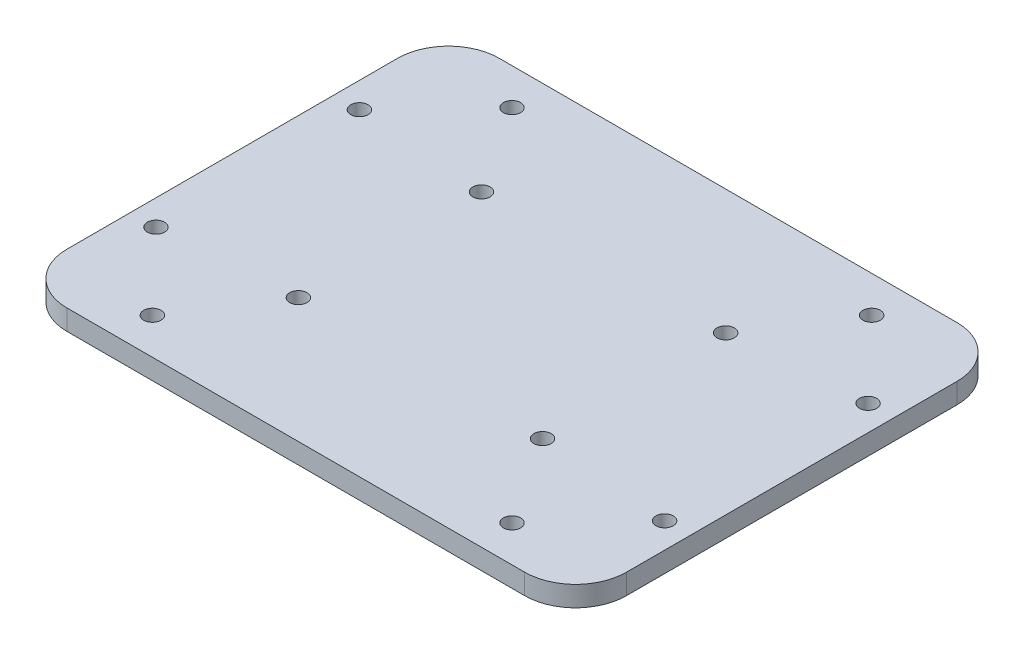
ISO-10303-21;
HEADER;
FILE_DESCRIPTION(('STEP AP214'),'2;1');
FILE_NAME('part.step','',(''),(''),'','','');
FILE_SCHEMA(('AUTOMOTIVE_DESIGN { 1 0 10303 214 1 1 1 1 }'));
ENDSEC;
DATA;
#1=APPLICATION_CONTEXT('core data for automotive mechanical design processes');
#2=APPLICATION_PROTOCOL_DEFINITION('international standard','automotive_design',2000,#1);
#3=PRODUCT_CONTEXT('',#1,'mechanical');
#4=PRODUCT('Part','Part','',(#3));
#5=PRODUCT_RELATED_PRODUCT_CATEGORY('part','',(#4));
#6=PRODUCT_DEFINITION_FORMATION('','',#4);
#7=PRODUCT_DEFINITION_CONTEXT('part definition',#1,'design');
#8=PRODUCT_DEFINITION('design','',#6,#7);
#9=PRODUCT_DEFINITION_SHAPE('','',#8);
#10=(LENGTH_UNIT() NAMED_UNIT(*) SI_UNIT(.MILLI.,.METRE.));
#11=(NAMED_UNIT(*) PLANE_ANGLE_UNIT() SI_UNIT($,.RADIAN.));
#12=(NAMED_UNIT(*) SI_UNIT($,.STERADIAN.) SOLID_ANGLE_UNIT());
#13=UNCERTAINTY_MEASURE_WITH_UNIT(LENGTH_MEASURE(1.E-05),#10,'distance_accuracy_value','');
#14=(GEOMETRIC_REPRESENTATION_CONTEXT(3) GLOBAL_UNCERTAINTY_ASSIGNED_CONTEXT((#13)) GLOBAL_UNIT_ASSIGNED_CONTEXT((#10,
#11,#12)) REPRESENTATION_CONTEXT('',''));
#15=CARTESIAN_POINT('',(0.,0.,0.));
#16=DIRECTION('',(0.,0.,1.));
#17=DIRECTION('',(1.,0.,0.));
#18=AXIS2_PLACEMENT_3D('',#15,#16,#17);
#19=CARTESIAN_POINT('',(0.,4.,0.));
#20=DIRECTION('',(0.,1.,0.));
#21=DIRECTION('',(0.,0.,1.));
#22=AXIS2_PLACEMENT_3D('',#19,#20,#21);
#23=PLANE('',#22);
#24=CARTESIAN_POINT('',(50.,4.,20.));
#25=DIRECTION('',(0.,1.,0.));
#26=DIRECTION('',(0.,0.,1.));
#27=AXIS2_PLACEMENT_3D('',#24,#25,#26);
#28=CIRCLE('',#27,1.7);
#29=CARTESIAN_POINT('',(50.,4.,21.7));
#30=VERTEX_POINT('',#29);
#31=EDGE_CURVE('E250',#30,#30,#28,.T.);
#32=ORIENTED_EDGE('',*,*,#31,.F.);
#33=EDGE_LOOP('',(#32));
#34=FACE_BOUND('',#33,.T.);
#35=CARTESIAN_POINT('',(-50.,4.,-20.));
#36=DIRECTION('',(0.,1.,0.));
#37=DIRECTION('',(0.,0.,1.));
#38=AXIS2_PLACEMENT_3D('',#35,#36,#37);
#39=CIRCLE('',#38,1.7);
#40=CARTESIAN_POINT('',(-50.,4.,-18.3));
#41=VERTEX_POINT('',#40);
#42=EDGE_CURVE('E247',#41,#41,#39,.T.);
#43=ORIENTED_EDGE('',*,*,#42,.F.);
#44=EDGE_LOOP('',(#43));
#45=FACE_BOUND('',#44,.T.);
#46=CARTESIAN_POINT('',(-50.,4.,20.));
#47=DIRECTION('',(0.,1.,0.));
#48=DIRECTION('',(0.,0.,1.));
#49=AXIS2_PLACEMENT_3D('',#46,#47,#48);
#50=CIRCLE('',#49,1.7);
#51=CARTESIAN_POINT('',(-50.,4.,21.7));
#52=VERTEX_POINT('',#51);
#53=EDGE_CURVE('E252',#52,#52,#50,.T.);
#54=ORIENTED_EDGE('',*,*,#53,.F.);
#55=EDGE_LOOP('',(#54));
#56=FACE_BOUND('',#55,.T.);
#57=CARTESIAN_POINT('',(50.,4.,-20.));
#58=DIRECTION('',(0.,1.,0.));
#59=DIRECTION('',(0.,0.,1.));
#60=AXIS2_PLACEMENT_3D('',#57,#58,#59);
#61=CIRCLE('',#60,1.7);
#62=CARTESIAN_POINT('',(50.,4.,-18.3));
#63=VERTEX_POINT('',#62);
#64=EDGE_CURVE('E152',#63,#63,#61,.T.);
#65=ORIENTED_EDGE('',*,*,#64,.F.);
#66=EDGE_LOOP('',(#65));
#67=FACE_BOUND('',#66,.T.);
#68=CARTESIAN_POINT('',(35.355,4.,35.355));
#69=DIRECTION('',(0.,1.,0.));
#70=DIRECTION('',(0.,0.,1.));
#71=AXIS2_PLACEMENT_3D('',#68,#69,#70);
#72=CIRCLE('',#71,1.7);
#73=CARTESIAN_POINT('',(35.355,4.,37.055));
#74=VERTEX_POINT('',#73);
#75=EDGE_CURVE('E235',#74,#74,#72,.T.);
#76=ORIENTED_EDGE('',*,*,#75,.F.);
#77=EDGE_LOOP('',(#76));
#78=FACE_BOUND('',#77,.T.);
#79=CARTESIAN_POINT('',(-35.355,4.,-35.355));
#80=DIRECTION('',(0.,1.,0.));
#81=DIRECTION('',(0.,0.,1.));
#82=AXIS2_PLACEMENT_3D('',#79,#80,#81);
#83=CIRCLE('',#82,1.7);
#84=CARTESIAN_POINT('',(-35.355,4.,-33.655));
#85=VERTEX_POINT('',#84);
#86=EDGE_CURVE('E217',#85,#85,#83,.T.);
#87=ORIENTED_EDGE('',*,*,#86,.F.);
#88=EDGE_LOOP('',(#87));
#89=FACE_BOUND('',#88,.T.);
#90=CARTESIAN_POINT('',(-24.,4.,18.));
#91=DIRECTION('',(0.,1.,0.));
#92=DIRECTION('',(0.,0.,1.));
#93=AXIS2_PLACEMENT_3D('',#90,#91,#92);
#94=CIRCLE('',#93,1.7);
#95=CARTESIAN_POINT('',(-24.,4.,19.7));
#96=VERTEX_POINT('',#95);
#97=EDGE_CURVE('E206',#96,#96,#94,.T.);
#98=ORIENTED_EDGE('',*,*,#97,.F.);
#99=EDGE_LOOP('',(#98));
#100=FACE_BOUND('',#99,.T.);
#101=CARTESIAN_POINT('',(24.,4.,-18.));
#102=DIRECTION('',(0.,1.,0.));
#103=DIRECTION('',(0.,0.,1.));
#104=AXIS2_PLACEMENT_3D('',#101,#102,#103);
#105=CIRCLE('',#104,1.7);
#106=CARTESIAN_POINT('',(24.,4.,-16.3));
#107=VERTEX_POINT('',#106);
#108=EDGE_CURVE('E137',#107,#107,#105,.T.);
#109=ORIENTED_EDGE('',*,*,#108,.F.);
#110=EDGE_LOOP('',(#109));
#111=FACE_BOUND('',#110,.T.);
#112=DIRECTION('',(1.,0.,0.));
#113=VECTOR('',#112,1.);
#114=CARTESIAN_POINT('',(-55.,4.,42.5));
#115=LINE('',#114,#113);
#116=CARTESIAN_POINT('',(-45.,4.,42.5));
#117=VERTEX_POINT('',#116);
#118=CARTESIAN_POINT('',(45.,4.,42.5));
#119=VERTEX_POINT('',#118);
#120=EDGE_CURVE('E143',#117,#119,#115,.T.);
#121=ORIENTED_EDGE('',*,*,#120,.T.);
#122=CARTESIAN_POINT('',(45.,4.,32.5));
#123=DIRECTION('',(0.,1.,0.));
#124=DIRECTION('',(0.,0.,1.));
#125=AXIS2_PLACEMENT_3D('',#122,#123,#124);
#126=CIRCLE('',#125,10.);
#127=CARTESIAN_POINT('',(55.,4.,32.5));
#128=VERTEX_POINT('',#127);
#129=EDGE_CURVE('E180',#119,#128,#126,.T.);
#130=ORIENTED_EDGE('',*,*,#129,.T.);
#131=DIRECTION('',(0.,0.,-1.));
#132=VECTOR('',#131,1.);
#133=CARTESIAN_POINT('',(55.,4.,-42.5));
#134=LINE('',#133,#132);
#135=CARTESIAN_POINT('',(55.,4.,-32.5));
#136=VERTEX_POINT('',#135);
#137=EDGE_CURVE('E130',#128,#136,#134,.T.);
#138=ORIENTED_EDGE('',*,*,#137,.T.);
#139=CARTESIAN_POINT('',(45.,4.,-32.5));
#140=DIRECTION('',(0.,1.,0.));
#141=DIRECTION('',(0.,0.,1.));
#142=AXIS2_PLACEMENT_3D('',#139,#140,#141);
#143=CIRCLE('',#142,10.);
#144=CARTESIAN_POINT('',(45.,4.,-42.5));
#145=VERTEX_POINT('',#144);
#146=EDGE_CURVE('E172',#136,#145,#143,.T.);
#147=ORIENTED_EDGE('',*,*,#146,.T.);
#148=DIRECTION('',(-1.,0.,0.));
#149=VECTOR('',#148,1.);
#150=CARTESIAN_POINT('',(-55.,4.,-42.5));
#151=LINE('',#150,#149);
#152=CARTESIAN_POINT('',(-45.,4.,-42.5));
#153=VERTEX_POINT('',#152);
#154=EDGE_CURVE('E189',#145,#153,#151,.T.);
#155=ORIENTED_EDGE('',*,*,#154,.T.);
#156=CARTESIAN_POINT('',(-45.,4.,-32.5));
#157=DIRECTION('',(0.,1.,0.));
#158=DIRECTION('',(0.,0.,1.));
#159=AXIS2_PLACEMENT_3D('',#156,#157,#158);
#160=CIRCLE('',#159,10.);
#161=CARTESIAN_POINT('',(-55.,4.,-32.5));
#162=VERTEX_POINT('',#161);
#163=EDGE_CURVE('E64',#153,#162,#160,.T.);
#164=ORIENTED_EDGE('',*,*,#163,.T.);
#165=DIRECTION('',(0.,0.,1.));
#166=VECTOR('',#165,1.);
#167=CARTESIAN_POINT('',(-55.,4.,-42.5));
#168=LINE('',#167,#166);
#169=CARTESIAN_POINT('',(-55.,4.,32.5));
#170=VERTEX_POINT('',#169);
#171=EDGE_CURVE('E199',#162,#170,#168,.T.);
#172=ORIENTED_EDGE('',*,*,#171,.T.);
#173=CARTESIAN_POINT('',(-45.,4.,32.5));
#174=DIRECTION('',(0.,1.,0.));
#175=DIRECTION('',(0.,0.,1.));
#176=AXIS2_PLACEMENT_3D('',#173,#174,#175);
#177=CIRCLE('',#176,10.);
#178=EDGE_CURVE('E175',#170,#117,#177,.T.);
#179=ORIENTED_EDGE('',*,*,#178,.T.);
#180=EDGE_LOOP('',(#121,#130,#138,#147,#155,#164,#172,#179));
#181=FACE_BOUND('',#180,.T.);
#182=CARTESIAN_POINT('',(-24.,4.,-18.));
#183=DIRECTION('',(0.,1.,0.));
#184=DIRECTION('',(0.,0.,1.));
#185=AXIS2_PLACEMENT_3D('',#182,#183,#184);
#186=CIRCLE('',#185,1.7);
#187=CARTESIAN_POINT('',(-24.,4.,-16.3));
#188=VERTEX_POINT('',#187);
#189=EDGE_CURVE('E204',#188,#188,#186,.T.);
#190=ORIENTED_EDGE('',*,*,#189,.F.);
#191=EDGE_LOOP('',(#190));
#192=FACE_BOUND('',#191,.T.);
#193=CARTESIAN_POINT('',(24.,4.,18.));
#194=DIRECTION('',(0.,1.,0.));
#195=DIRECTION('',(0.,0.,1.));
#196=AXIS2_PLACEMENT_3D('',#193,#194,#195);
#197=CIRCLE('',#196,1.7);
#198=CARTESIAN_POINT('',(24.,4.,19.7));
#199=VERTEX_POINT('',#198);
#200=EDGE_CURVE('E211',#199,#199,#197,.T.);
#201=ORIENTED_EDGE('',*,*,#200,.F.);
#202=EDGE_LOOP('',(#201));
#203=FACE_BOUND('',#202,.T.);
#204=CARTESIAN_POINT('',(35.355,4.,-35.355));
#205=DIRECTION('',(0.,1.,0.));
#206=DIRECTION('',(0.,0.,1.));
#207=AXIS2_PLACEMENT_3D('',#204,#205,#206);
#208=CIRCLE('',#207,1.7);
#209=CARTESIAN_POINT('',(35.355,4.,-33.655));
#210=VERTEX_POINT('',#209);
#211=EDGE_CURVE('E228',#210,#210,#208,.T.);
#212=ORIENTED_EDGE('',*,*,#211,.F.);
#213=EDGE_LOOP('',(#212));
#214=FACE_BOUND('',#213,.T.);
#215=CARTESIAN_POINT('',(-35.355,4.,35.355));
#216=DIRECTION('',(0.,1.,0.));
#217=DIRECTION('',(0.,0.,1.));
#218=AXIS2_PLACEMENT_3D('',#215,#216,#217);
#219=CIRCLE('',#218,1.7);
#220=CARTESIAN_POINT('',(-35.355,4.,37.055));
#221=VERTEX_POINT('',#220);
#222=EDGE_CURVE('E238',#221,#221,#219,.T.);
#223=ORIENTED_EDGE('',*,*,#222,.F.);
#224=EDGE_LOOP('',(#223));
#225=FACE_BOUND('',#224,.T.);
#226=ADVANCED_FACE('F41',(#34,#45,#56,#67,#78,#89,#100,#111,#181,#192,#203,#214,#225),#23,.T.);
#227=CARTESIAN_POINT('',(0.,0.,0.));
#228=DIRECTION('',(0.,1.,0.));
#229=DIRECTION('',(0.,0.,1.));
#230=AXIS2_PLACEMENT_3D('',#227,#228,#229);
#231=PLANE('',#230);
#232=CARTESIAN_POINT('',(50.,0.,20.));
#233=DIRECTION('',(0.,1.,0.));
#234=DIRECTION('',(0.,0.,1.));
#235=AXIS2_PLACEMENT_3D('',#232,#233,#234);
#236=CIRCLE('',#235,1.7);
#237=CARTESIAN_POINT('',(50.,0.,21.7));
#238=VERTEX_POINT('',#237);
#239=EDGE_CURVE('E163',#238,#238,#236,.T.);
#240=ORIENTED_EDGE('',*,*,#239,.T.);
#241=EDGE_LOOP('',(#240));
#242=FACE_BOUND('',#241,.T.);
#243=CARTESIAN_POINT('',(-50.,0.,-20.));
#244=DIRECTION('',(0.,1.,0.));
#245=DIRECTION('',(0.,0.,1.));
#246=AXIS2_PLACEMENT_3D('',#243,#244,#245);
#247=CIRCLE('',#246,1.7);
#248=CARTESIAN_POINT('',(-50.,0.,-18.3));
#249=VERTEX_POINT('',#248);
#250=EDGE_CURVE('E159',#249,#249,#247,.T.);
#251=ORIENTED_EDGE('',*,*,#250,.T.);
#252=EDGE_LOOP('',(#251));
#253=FACE_BOUND('',#252,.T.);
#254=CARTESIAN_POINT('',(-50.,0.,20.));
#255=DIRECTION('',(0.,1.,0.));
#256=DIRECTION('',(0.,0.,1.));
#257=AXIS2_PLACEMENT_3D('',#254,#255,#256);
#258=CIRCLE('',#257,1.7);
#259=CARTESIAN_POINT('',(-50.,0.,21.7));
#260=VERTEX_POINT('',#259);
#261=EDGE_CURVE('E153',#260,#260,#258,.T.);
#262=ORIENTED_EDGE('',*,*,#261,.T.);
#263=EDGE_LOOP('',(#262));
#264=FACE_BOUND('',#263,.T.);
#265=CARTESIAN_POINT('',(50.,0.,-20.));
#266=DIRECTION('',(0.,1.,0.));
#267=DIRECTION('',(0.,0.,1.));
#268=AXIS2_PLACEMENT_3D('',#265,#266,#267);
#269=CIRCLE('',#268,1.7);
#270=CARTESIAN_POINT('',(50.,0.,-18.3));
#271=VERTEX_POINT('',#270);
#272=EDGE_CURVE('E154',#271,#271,#269,.T.);
#273=ORIENTED_EDGE('',*,*,#272,.T.);
#274=EDGE_LOOP('',(#273));
#275=FACE_BOUND('',#274,.T.);
#276=DIRECTION('',(0.,0.,-1.));
#277=VECTOR('',#276,1.);
#278=CARTESIAN_POINT('',(55.,0.,-42.5));
#279=LINE('',#278,#277);
#280=CARTESIAN_POINT('',(55.,0.,32.5));
#281=VERTEX_POINT('',#280);
#282=CARTESIAN_POINT('',(55.,0.,-32.5));
#283=VERTEX_POINT('',#282);
#284=EDGE_CURVE('E121',#281,#283,#279,.T.);
#285=ORIENTED_EDGE('',*,*,#284,.F.);
#286=CARTESIAN_POINT('',(45.,0.,32.5));
#287=DIRECTION('',(0.,1.,0.));
#288=DIRECTION('',(0.,0.,1.));
#289=AXIS2_PLACEMENT_3D('',#286,#287,#288);
#290=CIRCLE('',#289,10.);
#291=CARTESIAN_POINT('',(45.,0.,42.5));
#292=VERTEX_POINT('',#291);
#293=EDGE_CURVE('E110',#281,#292,#290,.F.);
#294=ORIENTED_EDGE('',*,*,#293,.T.);
#295=DIRECTION('',(1.,0.,0.));
#296=VECTOR('',#295,1.);
#297=CARTESIAN_POINT('',(-55.,0.,42.5));
#298=LINE('',#297,#296);
#299=CARTESIAN_POINT('',(-45.,0.,42.5));
#300=VERTEX_POINT('',#299);
#301=EDGE_CURVE('E146',#300,#292,#298,.T.);
#302=ORIENTED_EDGE('',*,*,#301,.F.);
#303=CARTESIAN_POINT('',(-45.,0.,32.5));
#304=DIRECTION('',(0.,1.,0.));
#305=DIRECTION('',(0.,0.,1.));
#306=AXIS2_PLACEMENT_3D('',#303,#304,#305);
#307=CIRCLE('',#306,10.);
#308=CARTESIAN_POINT('',(-55.,0.,32.5));
#309=VERTEX_POINT('',#308);
#310=EDGE_CURVE('E129',#300,#309,#307,.F.);
#311=ORIENTED_EDGE('',*,*,#310,.T.);
#312=DIRECTION('',(0.,0.,1.));
#313=VECTOR('',#312,1.);
#314=CARTESIAN_POINT('',(-55.,0.,-42.5));
#315=LINE('',#314,#313);
#316=CARTESIAN_POINT('',(-55.,0.,-32.5));
#317=VERTEX_POINT('',#316);
#318=EDGE_CURVE('E136',#317,#309,#315,.T.);
#319=ORIENTED_EDGE('',*,*,#318,.F.);
#320=CARTESIAN_POINT('',(-45.,0.,-32.5));
#321=DIRECTION('',(0.,1.,0.));
#322=DIRECTION('',(0.,0.,1.));
#323=AXIS2_PLACEMENT_3D('',#320,#321,#322);
#324=CIRCLE('',#323,10.);
#325=CARTESIAN_POINT('',(-45.,0.,-42.5));
#326=VERTEX_POINT('',#325);
#327=EDGE_CURVE('E117',#317,#326,#324,.F.);
#328=ORIENTED_EDGE('',*,*,#327,.T.);
#329=DIRECTION('',(-1.,0.,0.));
#330=VECTOR('',#329,1.);
#331=CARTESIAN_POINT('',(-55.,0.,-42.5));
#332=LINE('',#331,#330);
#333=CARTESIAN_POINT('',(45.,0.,-42.5));
#334=VERTEX_POINT('',#333);
#335=EDGE_CURVE('E132',#334,#326,#332,.T.);
#336=ORIENTED_EDGE('',*,*,#335,.F.);
#337=CARTESIAN_POINT('',(45.,0.,-32.5));
#338=DIRECTION('',(0.,1.,0.));
#339=DIRECTION('',(0.,0.,1.));
#340=AXIS2_PLACEMENT_3D('',#337,#338,#339);
#341=CIRCLE('',#340,10.);
#342=EDGE_CURVE('E133',#334,#283,#341,.F.);
#343=ORIENTED_EDGE('',*,*,#342,.T.);
#344=EDGE_LOOP('',(#285,#294,#302,#311,#319,#328,#336,#343));
#345=FACE_BOUND('',#344,.T.);
#346=CARTESIAN_POINT('',(24.,0.,-18.));
#347=DIRECTION('',(0.,1.,0.));
#348=DIRECTION('',(0.,0.,1.));
#349=AXIS2_PLACEMENT_3D('',#346,#347,#348);
#350=CIRCLE('',#349,1.7);
#351=CARTESIAN_POINT('',(24.,0.,-16.3));
#352=VERTEX_POINT('',#351);
#353=EDGE_CURVE('E145',#352,#352,#350,.T.);
#354=ORIENTED_EDGE('',*,*,#353,.T.);
#355=EDGE_LOOP('',(#354));
#356=FACE_BOUND('',#355,.T.);
#357=CARTESIAN_POINT('',(-24.,0.,-18.));
#358=DIRECTION('',(0.,1.,0.));
#359=DIRECTION('',(0.,0.,1.));
#360=AXIS2_PLACEMENT_3D('',#357,#358,#359);
#361=CIRCLE('',#360,1.7);
#362=CARTESIAN_POINT('',(-24.,0.,-16.3));
#363=VERTEX_POINT('',#362);
#364=EDGE_CURVE('E203',#363,#363,#361,.T.);
#365=ORIENTED_EDGE('',*,*,#364,.T.);
#366=EDGE_LOOP('',(#365));
#367=FACE_BOUND('',#366,.T.);
#368=CARTESIAN_POINT('',(-24.,0.,18.));
#369=DIRECTION('',(0.,1.,0.));
#370=DIRECTION('',(0.,0.,1.));
#371=AXIS2_PLACEMENT_3D('',#368,#369,#370);
#372=CIRCLE('',#371,1.7);
#373=CARTESIAN_POINT('',(-24.,0.,19.7));
#374=VERTEX_POINT('',#373);
#375=EDGE_CURVE('E212',#374,#374,#372,.T.);
#376=ORIENTED_EDGE('',*,*,#375,.T.);
#377=EDGE_LOOP('',(#376));
#378=FACE_BOUND('',#377,.T.);
#379=CARTESIAN_POINT('',(24.,0.,18.));
#380=DIRECTION('',(0.,1.,0.));
#381=DIRECTION('',(0.,0.,1.));
#382=AXIS2_PLACEMENT_3D('',#379,#380,#381);
#383=CIRCLE('',#382,1.7);
#384=CARTESIAN_POINT('',(24.,0.,19.7));
#385=VERTEX_POINT('',#384);
#386=EDGE_CURVE('E216',#385,#385,#383,.T.);
#387=ORIENTED_EDGE('',*,*,#386,.T.);
#388=EDGE_LOOP('',(#387));
#389=FACE_BOUND('',#388,.T.);
#390=CARTESIAN_POINT('',(-35.355,0.,-35.355));
#391=DIRECTION('',(0.,1.,0.));
#392=DIRECTION('',(0.,0.,1.));
#393=AXIS2_PLACEMENT_3D('',#390,#391,#392);
#394=CIRCLE('',#393,1.7);
#395=CARTESIAN_POINT('',(-35.355,0.,-33.655));
#396=VERTEX_POINT('',#395);
#397=EDGE_CURVE('E224',#396,#396,#394,.T.);
#398=ORIENTED_EDGE('',*,*,#397,.T.);
#399=EDGE_LOOP('',(#398));
#400=FACE_BOUND('',#399,.T.);
#401=CARTESIAN_POINT('',(35.355,0.,-35.355));
#402=DIRECTION('',(0.,1.,0.));
#403=DIRECTION('',(0.,0.,1.));
#404=AXIS2_PLACEMENT_3D('',#401,#402,#403);
#405=CIRCLE('',#404,1.7);
#406=CARTESIAN_POINT('',(35.355,0.,-33.655));
#407=VERTEX_POINT('',#406);
#408=EDGE_CURVE('E230',#407,#407,#405,.T.);
#409=ORIENTED_EDGE('',*,*,#408,.T.);
#410=EDGE_LOOP('',(#409));
#411=FACE_BOUND('',#410,.T.);
#412=CARTESIAN_POINT('',(35.355,0.,35.355));
#413=DIRECTION('',(0.,1.,0.));
#414=DIRECTION('',(0.,0.,1.));
#415=AXIS2_PLACEMENT_3D('',#412,#413,#414);
#416=CIRCLE('',#415,1.7);
#417=CARTESIAN_POINT('',(35.355,0.,37.055));
#418=VERTEX_POINT('',#417);
#419=EDGE_CURVE('E232',#418,#418,#416,.T.);
#420=ORIENTED_EDGE('',*,*,#419,.T.);
#421=EDGE_LOOP('',(#420));
#422=FACE_BOUND('',#421,.T.);
#423=CARTESIAN_POINT('',(-35.355,0.,35.355));
#424=DIRECTION('',(0.,1.,0.));
#425=DIRECTION('',(0.,0.,1.));
#426=AXIS2_PLACEMENT_3D('',#423,#424,#425);
#427=CIRCLE('',#426,1.7);
#428=CARTESIAN_POINT('',(-35.355,0.,37.055));
#429=VERTEX_POINT('',#428);
#430=EDGE_CURVE('E165',#429,#429,#427,.T.);
#431=ORIENTED_EDGE('',*,*,#430,.T.);
#432=EDGE_LOOP('',(#431));
#433=FACE_BOUND('',#432,.T.);
#434=ADVANCED_FACE('F134',(#242,#253,#264,#275,#345,#356,#367,#378,#389,#400,#411,#422,#433),
#231,.F.);
#435=CARTESIAN_POINT('',(55.,4.,-42.5));
#436=DIRECTION('',(-1.,0.,0.));
#437=DIRECTION('',(0.,0.,1.));
#438=AXIS2_PLACEMENT_3D('',#435,#436,#437);
#439=PLANE('',#438);
#440=ORIENTED_EDGE('',*,*,#137,.F.);
#441=DIRECTION('',(0.,-1.,0.));
#442=VECTOR('',#441,1.);
#443=CARTESIAN_POINT('',(55.,4.,32.5));
#444=LINE('',#443,#442);
#445=EDGE_CURVE('E111',#128,#281,#444,.T.);
#446=ORIENTED_EDGE('',*,*,#445,.T.);
#447=ORIENTED_EDGE('',*,*,#284,.T.);
#448=DIRECTION('',(0.,-1.,0.));
#449=VECTOR('',#448,1.);
#450=CARTESIAN_POINT('',(55.,4.,-32.5));
#451=LINE('',#450,#449);
#452=EDGE_CURVE('E126',#283,#136,#451,.F.);
#453=ORIENTED_EDGE('',*,*,#452,.T.);
#454=EDGE_LOOP('',(#440,#446,#447,#453));
#455=FACE_BOUND('',#454,.T.);
#456=ADVANCED_FACE('F124',(#455),#439,.F.);
#457=CARTESIAN_POINT('',(-55.,4.,-42.5));
#458=DIRECTION('',(0.,0.,1.));
#459=DIRECTION('',(1.,0.,0.));
#460=AXIS2_PLACEMENT_3D('',#457,#458,#459);
#461=PLANE('',#460);
#462=ORIENTED_EDGE('',*,*,#335,.T.);
#463=DIRECTION('',(0.,-1.,0.));
#464=VECTOR('',#463,1.);
#465=CARTESIAN_POINT('',(-45.,4.,-42.5));
#466=LINE('',#465,#464);
#467=EDGE_CURVE('E11',#326,#153,#466,.F.);
#468=ORIENTED_EDGE('',*,*,#467,.T.);
#469=ORIENTED_EDGE('',*,*,#154,.F.);
#470=DIRECTION('',(0.,-1.,0.));
#471=VECTOR('',#470,1.);
#472=CARTESIAN_POINT('',(45.,4.,-42.5));
#473=LINE('',#472,#471);
#474=EDGE_CURVE('E47',#145,#334,#473,.T.);
#475=ORIENTED_EDGE('',*,*,#474,.T.);
#476=EDGE_LOOP('',(#462,#468,#469,#475));
#477=FACE_BOUND('',#476,.T.);
#478=ADVANCED_FACE('F187',(#477),#461,.F.);
#479=CARTESIAN_POINT('',(-55.,4.,-42.5));
#480=DIRECTION('',(1.,0.,0.));
#481=DIRECTION('',(0.,0.,-1.));
#482=AXIS2_PLACEMENT_3D('',#479,#480,#481);
#483=PLANE('',#482);
#484=ORIENTED_EDGE('',*,*,#171,.F.);
#485=DIRECTION('',(0.,-1.,0.));
#486=VECTOR('',#485,1.);
#487=CARTESIAN_POINT('',(-55.,4.,-32.5));
#488=LINE('',#487,#486);
#489=EDGE_CURVE('E179',#162,#317,#488,.T.);
#490=ORIENTED_EDGE('',*,*,#489,.T.);
#491=ORIENTED_EDGE('',*,*,#318,.T.);
#492=DIRECTION('',(0.,-1.,0.));
#493=VECTOR('',#492,1.);
#494=CARTESIAN_POINT('',(-55.,4.,32.5));
#495=LINE('',#494,#493);
#496=EDGE_CURVE('E57',#309,#170,#495,.F.);
#497=ORIENTED_EDGE('',*,*,#496,.T.);
#498=EDGE_LOOP('',(#484,#490,#491,#497));
#499=FACE_BOUND('',#498,.T.);
#500=ADVANCED_FACE('F193',(#499),#483,.F.);
#501=CARTESIAN_POINT('',(-55.,4.,42.5));
#502=DIRECTION('',(0.,0.,-1.));
#503=DIRECTION('',(-1.,0.,0.));
#504=AXIS2_PLACEMENT_3D('',#501,#502,#503);
#505=PLANE('',#504);
#506=ORIENTED_EDGE('',*,*,#301,.T.);
#507=DIRECTION('',(0.,-1.,0.));
#508=VECTOR('',#507,1.);
#509=CARTESIAN_POINT('',(45.,4.,42.5));
#510=LINE('',#509,#508);
#511=EDGE_CURVE('E115',#292,#119,#510,.F.);
#512=ORIENTED_EDGE('',*,*,#511,.T.);
#513=ORIENTED_EDGE('',*,*,#120,.F.);
#514=DIRECTION('',(0.,-1.,0.));
#515=VECTOR('',#514,1.);
#516=CARTESIAN_POINT('',(-45.,4.,42.5));
#517=LINE('',#516,#515);
#518=EDGE_CURVE('E120',#117,#300,#517,.T.);
#519=ORIENTED_EDGE('',*,*,#518,.T.);
#520=EDGE_LOOP('',(#506,#512,#513,#519));
#521=FACE_BOUND('',#520,.T.);
#522=ADVANCED_FACE('F301',(#521),#505,.F.);
#523=CARTESIAN_POINT('',(24.,4.,-18.));
#524=DIRECTION('',(0.,-1.,0.));
#525=DIRECTION('',(0.,0.,-1.));
#526=AXIS2_PLACEMENT_3D('',#523,#524,#525);
#527=CYLINDRICAL_SURFACE('',#526,1.7);
#528=ORIENTED_EDGE('',*,*,#108,.T.);
#529=EDGE_LOOP('',(#528));
#530=FACE_BOUND('',#529,.T.);
#531=ORIENTED_EDGE('',*,*,#353,.F.);
#532=EDGE_LOOP('',(#531));
#533=FACE_BOUND('',#532,.T.);
#534=ADVANCED_FACE('F302',(#530,#533),#527,.F.);
#535=CARTESIAN_POINT('',(-24.,4.,-18.));
#536=DIRECTION('',(0.,-1.,0.));
#537=DIRECTION('',(0.,0.,-1.));
#538=AXIS2_PLACEMENT_3D('',#535,#536,#537);
#539=CYLINDRICAL_SURFACE('',#538,1.7);
#540=ORIENTED_EDGE('',*,*,#189,.T.);
#541=EDGE_LOOP('',(#540));
#542=FACE_BOUND('',#541,.T.);
#543=ORIENTED_EDGE('',*,*,#364,.F.);
#544=EDGE_LOOP('',(#543));
#545=FACE_BOUND('',#544,.T.);
#546=ADVANCED_FACE('F431',(#542,#545),#539,.F.);
#547=CARTESIAN_POINT('',(-24.,4.,18.));
#548=DIRECTION('',(0.,-1.,0.));
#549=DIRECTION('',(0.,0.,-1.));
#550=AXIS2_PLACEMENT_3D('',#547,#548,#549);
#551=CYLINDRICAL_SURFACE('',#550,1.7);
#552=ORIENTED_EDGE('',*,*,#97,.T.);
#553=EDGE_LOOP('',(#552));
#554=FACE_BOUND('',#553,.T.);
#555=ORIENTED_EDGE('',*,*,#375,.F.);
#556=EDGE_LOOP('',(#555));
#557=FACE_BOUND('',#556,.T.);
#558=ADVANCED_FACE('F423',(#554,#557),#551,.F.);
#559=CARTESIAN_POINT('',(24.,4.,18.));
#560=DIRECTION('',(0.,-1.,0.));
#561=DIRECTION('',(0.,0.,-1.));
#562=AXIS2_PLACEMENT_3D('',#559,#560,#561);
#563=CYLINDRICAL_SURFACE('',#562,1.7);
#564=ORIENTED_EDGE('',*,*,#200,.T.);
#565=EDGE_LOOP('',(#564));
#566=FACE_BOUND('',#565,.T.);
#567=ORIENTED_EDGE('',*,*,#386,.F.);
#568=EDGE_LOOP('',(#567));
#569=FACE_BOUND('',#568,.T.);
#570=ADVANCED_FACE('F414',(#566,#569),#563,.F.);
#571=CARTESIAN_POINT('',(-35.355,4.,-35.355));
#572=DIRECTION('',(0.,-1.,0.));
#573=DIRECTION('',(0.,0.,-1.));
#574=AXIS2_PLACEMENT_3D('',#571,#572,#573);
#575=CYLINDRICAL_SURFACE('',#574,1.7);
#576=ORIENTED_EDGE('',*,*,#86,.T.);
#577=EDGE_LOOP('',(#576));
#578=FACE_BOUND('',#577,.T.);
#579=ORIENTED_EDGE('',*,*,#397,.F.);
#580=EDGE_LOOP('',(#579));
#581=FACE_BOUND('',#580,.T.);
#582=ADVANCED_FACE('F402',(#578,#581),#575,.F.);
#583=CARTESIAN_POINT('',(35.355,4.,-35.355));
#584=DIRECTION('',(0.,-1.,0.));
#585=DIRECTION('',(0.,0.,-1.));
#586=AXIS2_PLACEMENT_3D('',#583,#584,#585);
#587=CYLINDRICAL_SURFACE('',#586,1.7);
#588=ORIENTED_EDGE('',*,*,#211,.T.);
#589=EDGE_LOOP('',(#588));
#590=FACE_BOUND('',#589,.T.);
#591=ORIENTED_EDGE('',*,*,#408,.F.);
#592=EDGE_LOOP('',(#591));
#593=FACE_BOUND('',#592,.T.);
#594=ADVANCED_FACE('F394',(#590,#593),#587,.F.);
#595=CARTESIAN_POINT('',(35.355,4.,35.355));
#596=DIRECTION('',(0.,-1.,0.));
#597=DIRECTION('',(0.,0.,-1.));
#598=AXIS2_PLACEMENT_3D('',#595,#596,#597);
#599=CYLINDRICAL_SURFACE('',#598,1.7);
#600=ORIENTED_EDGE('',*,*,#75,.T.);
#601=EDGE_LOOP('',(#600));
#602=FACE_BOUND('',#601,.T.);
#603=ORIENTED_EDGE('',*,*,#419,.F.);
#604=EDGE_LOOP('',(#603));
#605=FACE_BOUND('',#604,.T.);
#606=ADVANCED_FACE('F290',(#602,#605),#599,.F.);
#607=CARTESIAN_POINT('',(-35.355,4.,35.355));
#608=DIRECTION('',(0.,-1.,0.));
#609=DIRECTION('',(0.,0.,-1.));
#610=AXIS2_PLACEMENT_3D('',#607,#608,#609);
#611=CYLINDRICAL_SURFACE('',#610,1.7);
#612=ORIENTED_EDGE('',*,*,#222,.T.);
#613=EDGE_LOOP('',(#612));
#614=FACE_BOUND('',#613,.T.);
#615=ORIENTED_EDGE('',*,*,#430,.F.);
#616=EDGE_LOOP('',(#615));
#617=FACE_BOUND('',#616,.T.);
#618=ADVANCED_FACE('F285',(#614,#617),#611,.F.);
#619=CARTESIAN_POINT('',(50.,-6.,-20.));
#620=DIRECTION('',(0.,1.,0.));
#621=DIRECTION('',(0.,0.,1.));
#622=AXIS2_PLACEMENT_3D('',#619,#620,#621);
#623=CYLINDRICAL_SURFACE('',#622,1.7);
#624=ORIENTED_EDGE('',*,*,#64,.T.);
#625=EDGE_LOOP('',(#624));
#626=FACE_BOUND('',#625,.T.);
#627=ORIENTED_EDGE('',*,*,#272,.F.);
#628=EDGE_LOOP('',(#627));
#629=FACE_BOUND('',#628,.T.);
#630=ADVANCED_FACE('F287',(#626,#629),#623,.F.);
#631=CARTESIAN_POINT('',(-50.,-6.,20.));
#632=DIRECTION('',(0.,1.,0.));
#633=DIRECTION('',(0.,0.,1.));
#634=AXIS2_PLACEMENT_3D('',#631,#632,#633);
#635=CYLINDRICAL_SURFACE('',#634,1.7);
#636=ORIENTED_EDGE('',*,*,#53,.T.);
#637=EDGE_LOOP('',(#636));
#638=FACE_BOUND('',#637,.T.);
#639=ORIENTED_EDGE('',*,*,#261,.F.);
#640=EDGE_LOOP('',(#639));
#641=FACE_BOUND('',#640,.T.);
#642=ADVANCED_FACE('F260',(#638,#641),#635,.F.);
#643=CARTESIAN_POINT('',(-50.,-6.,-20.));
#644=DIRECTION('',(0.,1.,0.));
#645=DIRECTION('',(0.,0.,1.));
#646=AXIS2_PLACEMENT_3D('',#643,#644,#645);
#647=CYLINDRICAL_SURFACE('',#646,1.7);
#648=ORIENTED_EDGE('',*,*,#42,.T.);
#649=EDGE_LOOP('',(#648));
#650=FACE_BOUND('',#649,.T.);
#651=ORIENTED_EDGE('',*,*,#250,.F.);
#652=EDGE_LOOP('',(#651));
#653=FACE_BOUND('',#652,.T.);
#654=ADVANCED_FACE('F348',(#650,#653),#647,.F.);
#655=CARTESIAN_POINT('',(50.,-6.,20.));
#656=DIRECTION('',(0.,1.,0.));
#657=DIRECTION('',(0.,0.,1.));
#658=AXIS2_PLACEMENT_3D('',#655,#656,#657);
#659=CYLINDRICAL_SURFACE('',#658,1.7);
#660=ORIENTED_EDGE('',*,*,#31,.T.);
#661=EDGE_LOOP('',(#660));
#662=FACE_BOUND('',#661,.T.);
#663=ORIENTED_EDGE('',*,*,#239,.F.);
#664=EDGE_LOOP('',(#663));
#665=FACE_BOUND('',#664,.T.);
#666=ADVANCED_FACE('F315',(#662,#665),#659,.F.);
#667=CARTESIAN_POINT('',(45.,4.,32.5));
#668=DIRECTION('',(0.,-1.,0.));
#669=DIRECTION('',(0.,0.,-1.));
#670=AXIS2_PLACEMENT_3D('',#667,#668,#669);
#671=CYLINDRICAL_SURFACE('',#670,10.);
#672=ORIENTED_EDGE('',*,*,#129,.F.);
#673=ORIENTED_EDGE('',*,*,#511,.F.);
#674=ORIENTED_EDGE('',*,*,#293,.F.);
#675=ORIENTED_EDGE('',*,*,#445,.F.);
#676=EDGE_LOOP('',(#672,#673,#674,#675));
#677=FACE_BOUND('',#676,.T.);
#678=ADVANCED_FACE('F109',(#677),#671,.T.);
#679=CARTESIAN_POINT('',(-45.,4.,-32.5));
#680=DIRECTION('',(0.,-1.,0.));
#681=DIRECTION('',(0.,0.,-1.));
#682=AXIS2_PLACEMENT_3D('',#679,#680,#681);
#683=CYLINDRICAL_SURFACE('',#682,10.);
#684=ORIENTED_EDGE('',*,*,#163,.F.);
#685=ORIENTED_EDGE('',*,*,#467,.F.);
#686=ORIENTED_EDGE('',*,*,#327,.F.);
#687=ORIENTED_EDGE('',*,*,#489,.F.);
#688=EDGE_LOOP('',(#684,#685,#686,#687));
#689=FACE_BOUND('',#688,.T.);
#690=ADVANCED_FACE('F191',(#689),#683,.T.);
#691=CARTESIAN_POINT('',(45.,4.,-32.5));
#692=DIRECTION('',(0.,-1.,0.));
#693=DIRECTION('',(0.,0.,-1.));
#694=AXIS2_PLACEMENT_3D('',#691,#692,#693);
#695=CYLINDRICAL_SURFACE('',#694,10.);
#696=ORIENTED_EDGE('',*,*,#146,.F.);
#697=ORIENTED_EDGE('',*,*,#452,.F.);
#698=ORIENTED_EDGE('',*,*,#342,.F.);
#699=ORIENTED_EDGE('',*,*,#474,.F.);
#700=EDGE_LOOP('',(#696,#697,#698,#699));
#701=FACE_BOUND('',#700,.T.);
#702=ADVANCED_FACE('F313',(#701),#695,.T.);
#703=CARTESIAN_POINT('',(-45.,4.,32.5));
#704=DIRECTION('',(0.,-1.,0.));
#705=DIRECTION('',(0.,0.,-1.));
#706=AXIS2_PLACEMENT_3D('',#703,#704,#705);
#707=CYLINDRICAL_SURFACE('',#706,10.);
#708=ORIENTED_EDGE('',*,*,#178,.F.);
#709=ORIENTED_EDGE('',*,*,#496,.F.);
#710=ORIENTED_EDGE('',*,*,#310,.F.);
#711=ORIENTED_EDGE('',*,*,#518,.F.);
#712=EDGE_LOOP('',(#708,#709,#710,#711));
#713=FACE_BOUND('',#712,.T.);
#714=ADVANCED_FACE('F43',(#713),#707,.T.);
#715=CLOSED_SHELL('',(#226,#434,#456,#478,#500,#522,#534,#546,#558,#570,#582,#594,#606,#618,
#630,#642,#654,#666,#678,#690,#702,#714));
#716=MANIFOLD_SOLID_BREP('B2',#715);
#717=ADVANCED_BREP_SHAPE_REPRESENTATION('',(#18,#716),#14);
#718=SHAPE_DEFINITION_REPRESENTATION(#9,#717);
ENDSEC;
END-ISO-10303-21;
